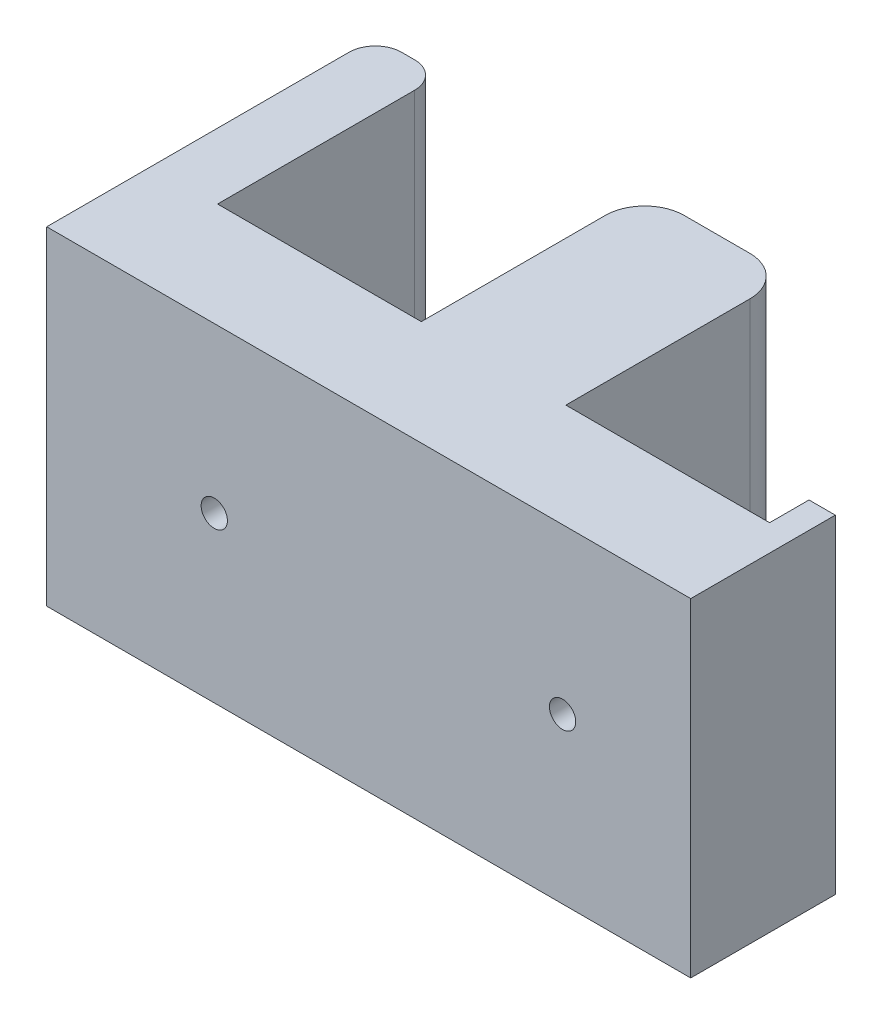
ISO-10303-21;
HEADER;
FILE_DESCRIPTION(('STEP AP214'),'2;1');
FILE_NAME('part.step','',(''),(''),'','','');
FILE_SCHEMA(('AUTOMOTIVE_DESIGN { 1 0 10303 214 1 1 1 1 }'));
ENDSEC;
DATA;
#1=APPLICATION_CONTEXT('core data for automotive mechanical design processes');
#2=APPLICATION_PROTOCOL_DEFINITION('international standard','automotive_design',2000,#1);
#3=PRODUCT_CONTEXT('',#1,'mechanical');
#4=PRODUCT('Part','Part','',(#3));
#5=PRODUCT_RELATED_PRODUCT_CATEGORY('part','',(#4));
#6=PRODUCT_DEFINITION_FORMATION('','',#4);
#7=PRODUCT_DEFINITION_CONTEXT('part definition',#1,'design');
#8=PRODUCT_DEFINITION('design','',#6,#7);
#9=PRODUCT_DEFINITION_SHAPE('','',#8);
#10=(LENGTH_UNIT() NAMED_UNIT(*) SI_UNIT(.MILLI.,.METRE.));
#11=(NAMED_UNIT(*) PLANE_ANGLE_UNIT() SI_UNIT($,.RADIAN.));
#12=(NAMED_UNIT(*) SI_UNIT($,.STERADIAN.) SOLID_ANGLE_UNIT());
#13=UNCERTAINTY_MEASURE_WITH_UNIT(LENGTH_MEASURE(1.E-05),#10,'distance_accuracy_value','');
#14=(GEOMETRIC_REPRESENTATION_CONTEXT(3) GLOBAL_UNCERTAINTY_ASSIGNED_CONTEXT((#13)) GLOBAL_UNIT_ASSIGNED_CONTEXT((#10,
#11,#12)) REPRESENTATION_CONTEXT('',''));
#15=CARTESIAN_POINT('',(0.,0.,0.));
#16=DIRECTION('',(0.,0.,1.));
#17=DIRECTION('',(1.,0.,0.));
#18=AXIS2_PLACEMENT_3D('',#15,#16,#17);
#19=CARTESIAN_POINT('',(0.,25.,0.));
#20=DIRECTION('',(0.,0.,-1.));
#21=DIRECTION('',(-1.,0.,0.));
#22=AXIS2_PLACEMENT_3D('',#19,#20,#21);
#23=PLANE('',#22);
#24=CARTESIAN_POINT('',(12.75,12.5,0.));
#25=DIRECTION('',(0.,0.,-1.));
#26=DIRECTION('',(-1.,0.,0.));
#27=AXIS2_PLACEMENT_3D('',#24,#25,#26);
#28=CIRCLE('',#27,1.);
#29=CARTESIAN_POINT('',(11.75,12.5,0.));
#30=VERTEX_POINT('',#29);
#31=EDGE_CURVE('E392',#30,#30,#28,.T.);
#32=ORIENTED_EDGE('',*,*,#31,.T.);
#33=EDGE_LOOP('',(#32));
#34=FACE_BOUND('',#33,.T.);
#35=CARTESIAN_POINT('',(39.25,12.5,0.));
#36=DIRECTION('',(0.,0.,-1.));
#37=DIRECTION('',(-1.,0.,0.));
#38=AXIS2_PLACEMENT_3D('',#35,#36,#37);
#39=CIRCLE('',#38,0.999999999999998);
#40=CARTESIAN_POINT('',(38.25,12.5,0.));
#41=VERTEX_POINT('',#40);
#42=EDGE_CURVE('E201',#41,#41,#39,.T.);
#43=ORIENTED_EDGE('',*,*,#42,.T.);
#44=EDGE_LOOP('',(#43));
#45=FACE_BOUND('',#44,.T.);
#46=DIRECTION('',(1.,0.,0.));
#47=VECTOR('',#46,1.);
#48=CARTESIAN_POINT('',(0.,0.,0.));
#49=LINE('',#48,#47);
#50=CARTESIAN_POINT('',(0.,0.,0.));
#51=VERTEX_POINT('',#50);
#52=CARTESIAN_POINT('',(49.,0.,0.));
#53=VERTEX_POINT('',#52);
#54=EDGE_CURVE('E163',#51,#53,#49,.T.);
#55=ORIENTED_EDGE('',*,*,#54,.T.);
#56=DIRECTION('',(0.,-1.,0.));
#57=VECTOR('',#56,1.);
#58=CARTESIAN_POINT('',(49.,25.,0.));
#59=LINE('',#58,#57);
#60=CARTESIAN_POINT('',(49.,25.,0.));
#61=VERTEX_POINT('',#60);
#62=EDGE_CURVE('E161',#61,#53,#59,.T.);
#63=ORIENTED_EDGE('',*,*,#62,.F.);
#64=DIRECTION('',(1.,0.,0.));
#65=VECTOR('',#64,1.);
#66=CARTESIAN_POINT('',(0.,25.,0.));
#67=LINE('',#66,#65);
#68=CARTESIAN_POINT('',(0.,25.,0.));
#69=VERTEX_POINT('',#68);
#70=EDGE_CURVE('E148',#69,#61,#67,.T.);
#71=ORIENTED_EDGE('',*,*,#70,.F.);
#72=DIRECTION('',(0.,-1.,0.));
#73=VECTOR('',#72,1.);
#74=CARTESIAN_POINT('',(0.,25.,0.));
#75=LINE('',#74,#73);
#76=EDGE_CURVE('E198',#69,#51,#75,.T.);
#77=ORIENTED_EDGE('',*,*,#76,.T.);
#78=EDGE_LOOP('',(#55,#63,#71,#77));
#79=FACE_BOUND('',#78,.T.);
#80=ADVANCED_FACE('F35',(#34,#45,#79),#23,.F.);
#81=CARTESIAN_POINT('',(49.,25.,0.));
#82=DIRECTION('',(1.,0.,0.));
#83=DIRECTION('',(0.,0.,-1.));
#84=AXIS2_PLACEMENT_3D('',#81,#82,#83);
#85=PLANE('',#84);
#86=DIRECTION('',(0.,0.,1.));
#87=VECTOR('',#86,1.);
#88=CARTESIAN_POINT('',(49.,0.,0.));
#89=LINE('',#88,#87);
#90=CARTESIAN_POINT('',(49.,0.,-11.));
#91=VERTEX_POINT('',#90);
#92=EDGE_CURVE('E200',#91,#53,#89,.T.);
#93=ORIENTED_EDGE('',*,*,#92,.F.);
#94=DIRECTION('',(0.,-1.,0.));
#95=VECTOR('',#94,1.);
#96=CARTESIAN_POINT('',(49.,25.,-11.));
#97=LINE('',#96,#95);
#98=CARTESIAN_POINT('',(49.,25.,-11.));
#99=VERTEX_POINT('',#98);
#100=EDGE_CURVE('E168',#99,#91,#97,.T.);
#101=ORIENTED_EDGE('',*,*,#100,.F.);
#102=DIRECTION('',(0.,0.,1.));
#103=VECTOR('',#102,1.);
#104=CARTESIAN_POINT('',(49.,25.,0.));
#105=LINE('',#104,#103);
#106=EDGE_CURVE('E153',#99,#61,#105,.T.);
#107=ORIENTED_EDGE('',*,*,#106,.T.);
#108=ORIENTED_EDGE('',*,*,#62,.T.);
#109=EDGE_LOOP('',(#93,#101,#107,#108));
#110=FACE_BOUND('',#109,.T.);
#111=ADVANCED_FACE('F170',(#110),#85,.T.);
#112=CARTESIAN_POINT('',(0.,25.,-11.0000000000001));
#113=DIRECTION('',(0.,0.,-1.));
#114=DIRECTION('',(-1.,0.,0.));
#115=AXIS2_PLACEMENT_3D('',#112,#113,#114);
#116=PLANE('',#115);
#117=DIRECTION('',(1.,0.,0.));
#118=VECTOR('',#117,1.);
#119=CARTESIAN_POINT('',(0.,0.,-11.0000000000001));
#120=LINE('',#119,#118);
#121=CARTESIAN_POINT('',(47.,0.,-11.));
#122=VERTEX_POINT('',#121);
#123=EDGE_CURVE('E203',#122,#91,#120,.T.);
#124=ORIENTED_EDGE('',*,*,#123,.F.);
#125=DIRECTION('',(0.,-1.,0.));
#126=VECTOR('',#125,1.);
#127=CARTESIAN_POINT('',(47.,25.,-11.));
#128=LINE('',#127,#126);
#129=CARTESIAN_POINT('',(47.,25.,-11.));
#130=VERTEX_POINT('',#129);
#131=EDGE_CURVE('E241',#130,#122,#128,.T.);
#132=ORIENTED_EDGE('',*,*,#131,.F.);
#133=DIRECTION('',(1.,0.,0.));
#134=VECTOR('',#133,1.);
#135=CARTESIAN_POINT('',(0.,25.,-11.0000000000001));
#136=LINE('',#135,#134);
#137=EDGE_CURVE('E171',#130,#99,#136,.T.);
#138=ORIENTED_EDGE('',*,*,#137,.T.);
#139=ORIENTED_EDGE('',*,*,#100,.T.);
#140=EDGE_LOOP('',(#124,#132,#138,#139));
#141=FACE_BOUND('',#140,.T.);
#142=ADVANCED_FACE('F327',(#141),#116,.T.);
#143=CARTESIAN_POINT('',(47.,25.,0.));
#144=DIRECTION('',(-1.,0.,0.));
#145=DIRECTION('',(0.,0.,1.));
#146=AXIS2_PLACEMENT_3D('',#143,#144,#145);
#147=PLANE('',#146);
#148=DIRECTION('',(0.,0.,-1.));
#149=VECTOR('',#148,1.);
#150=CARTESIAN_POINT('',(47.,0.,0.));
#151=LINE('',#150,#149);
#152=CARTESIAN_POINT('',(47.,0.,-8.));
#153=VERTEX_POINT('',#152);
#154=EDGE_CURVE('E206',#153,#122,#151,.T.);
#155=ORIENTED_EDGE('',*,*,#154,.F.);
#156=DIRECTION('',(0.,-1.,0.));
#157=VECTOR('',#156,1.);
#158=CARTESIAN_POINT('',(47.,25.,-8.));
#159=LINE('',#158,#157);
#160=CARTESIAN_POINT('',(47.,25.,-8.));
#161=VERTEX_POINT('',#160);
#162=EDGE_CURVE('E239',#161,#153,#159,.T.);
#163=ORIENTED_EDGE('',*,*,#162,.F.);
#164=DIRECTION('',(0.,0.,-1.));
#165=VECTOR('',#164,1.);
#166=CARTESIAN_POINT('',(47.,25.,0.));
#167=LINE('',#166,#165);
#168=EDGE_CURVE('E173',#161,#130,#167,.T.);
#169=ORIENTED_EDGE('',*,*,#168,.T.);
#170=ORIENTED_EDGE('',*,*,#131,.T.);
#171=EDGE_LOOP('',(#155,#163,#169,#170));
#172=FACE_BOUND('',#171,.T.);
#173=ADVANCED_FACE('F324',(#172),#147,.T.);
#174=CARTESIAN_POINT('',(0.,25.,-8.));
#175=DIRECTION('',(0.,0.,-1.));
#176=DIRECTION('',(-1.,0.,0.));
#177=AXIS2_PLACEMENT_3D('',#174,#175,#176);
#178=PLANE('',#177);
#179=CARTESIAN_POINT('',(39.25,12.5,-8.));
#180=DIRECTION('',(0.,0.,-1.));
#181=DIRECTION('',(-1.,0.,0.));
#182=AXIS2_PLACEMENT_3D('',#179,#180,#181);
#183=CIRCLE('',#182,0.999999999999998);
#184=CARTESIAN_POINT('',(38.25,12.5,-8.));
#185=VERTEX_POINT('',#184);
#186=EDGE_CURVE('E391',#185,#185,#183,.T.);
#187=ORIENTED_EDGE('',*,*,#186,.F.);
#188=EDGE_LOOP('',(#187));
#189=FACE_BOUND('',#188,.T.);
#190=DIRECTION('',(1.,0.,0.));
#191=VECTOR('',#190,1.);
#192=CARTESIAN_POINT('',(0.,0.,-8.));
#193=LINE('',#192,#191);
#194=CARTESIAN_POINT('',(31.5,0.,-8.));
#195=VERTEX_POINT('',#194);
#196=EDGE_CURVE('E209',#195,#153,#193,.T.);
#197=ORIENTED_EDGE('',*,*,#196,.F.);
#198=DIRECTION('',(0.,-1.,0.));
#199=VECTOR('',#198,1.);
#200=CARTESIAN_POINT('',(31.5,25.,-8.));
#201=LINE('',#200,#199);
#202=CARTESIAN_POINT('',(31.5,25.,-8.));
#203=VERTEX_POINT('',#202);
#204=EDGE_CURVE('E236',#203,#195,#201,.T.);
#205=ORIENTED_EDGE('',*,*,#204,.F.);
#206=DIRECTION('',(1.,0.,0.));
#207=VECTOR('',#206,1.);
#208=CARTESIAN_POINT('',(0.,25.,-8.));
#209=LINE('',#208,#207);
#210=EDGE_CURVE('E179',#203,#161,#209,.T.);
#211=ORIENTED_EDGE('',*,*,#210,.T.);
#212=ORIENTED_EDGE('',*,*,#162,.T.);
#213=EDGE_LOOP('',(#197,#205,#211,#212));
#214=FACE_BOUND('',#213,.T.);
#215=ADVANCED_FACE('F320',(#189,#214),#178,.T.);
#216=CARTESIAN_POINT('',(31.5,25.,0.));
#217=DIRECTION('',(1.,0.,0.));
#218=DIRECTION('',(0.,0.,-1.));
#219=AXIS2_PLACEMENT_3D('',#216,#217,#218);
#220=PLANE('',#219);
#221=DIRECTION('',(0.,0.,1.));
#222=VECTOR('',#221,1.);
#223=CARTESIAN_POINT('',(31.5,0.,0.));
#224=LINE('',#223,#222);
#225=CARTESIAN_POINT('',(31.5,0.,-22.));
#226=VERTEX_POINT('',#225);
#227=EDGE_CURVE('E212',#226,#195,#224,.T.);
#228=ORIENTED_EDGE('',*,*,#227,.F.);
#229=DIRECTION('',(0.,-1.,0.));
#230=VECTOR('',#229,1.);
#231=CARTESIAN_POINT('',(31.5,25.,-22.));
#232=LINE('',#231,#230);
#233=CARTESIAN_POINT('',(31.5,25.,-22.));
#234=VERTEX_POINT('',#233);
#235=EDGE_CURVE('E259',#226,#234,#232,.F.);
#236=ORIENTED_EDGE('',*,*,#235,.T.);
#237=DIRECTION('',(0.,0.,1.));
#238=VECTOR('',#237,1.);
#239=CARTESIAN_POINT('',(31.5,25.,0.));
#240=LINE('',#239,#238);
#241=EDGE_CURVE('E182',#234,#203,#240,.T.);
#242=ORIENTED_EDGE('',*,*,#241,.T.);
#243=ORIENTED_EDGE('',*,*,#204,.T.);
#244=EDGE_LOOP('',(#228,#236,#242,#243));
#245=FACE_BOUND('',#244,.T.);
#246=ADVANCED_FACE('F316',(#245),#220,.T.);
#247=CARTESIAN_POINT('',(0.,25.,-25.));
#248=DIRECTION('',(0.,0.,-1.));
#249=DIRECTION('',(-1.,0.,0.));
#250=AXIS2_PLACEMENT_3D('',#247,#248,#249);
#251=PLANE('',#250);
#252=DIRECTION('',(1.,0.,0.));
#253=VECTOR('',#252,1.);
#254=CARTESIAN_POINT('',(0.,0.,-25.));
#255=LINE('',#254,#253);
#256=CARTESIAN_POINT('',(23.5,0.,-25.));
#257=VERTEX_POINT('',#256);
#258=CARTESIAN_POINT('',(28.5,0.,-25.));
#259=VERTEX_POINT('',#258);
#260=EDGE_CURVE('E214',#257,#259,#255,.T.);
#261=ORIENTED_EDGE('',*,*,#260,.F.);
#262=DIRECTION('',(0.,-1.,0.));
#263=VECTOR('',#262,1.);
#264=CARTESIAN_POINT('',(23.5,25.,-25.));
#265=LINE('',#264,#263);
#266=CARTESIAN_POINT('',(23.5,25.,-25.));
#267=VERTEX_POINT('',#266);
#268=EDGE_CURVE('E253',#257,#267,#265,.F.);
#269=ORIENTED_EDGE('',*,*,#268,.T.);
#270=DIRECTION('',(1.,0.,0.));
#271=VECTOR('',#270,1.);
#272=CARTESIAN_POINT('',(0.,25.,-25.));
#273=LINE('',#272,#271);
#274=CARTESIAN_POINT('',(28.5,25.,-25.));
#275=VERTEX_POINT('',#274);
#276=EDGE_CURVE('E184',#267,#275,#273,.T.);
#277=ORIENTED_EDGE('',*,*,#276,.T.);
#278=DIRECTION('',(0.,-1.,0.));
#279=VECTOR('',#278,1.);
#280=CARTESIAN_POINT('',(28.5,25.,-25.));
#281=LINE('',#280,#279);
#282=EDGE_CURVE('E250',#275,#259,#281,.T.);
#283=ORIENTED_EDGE('',*,*,#282,.T.);
#284=EDGE_LOOP('',(#261,#269,#277,#283));
#285=FACE_BOUND('',#284,.T.);
#286=ADVANCED_FACE('F306',(#285),#251,.T.);
#287=CARTESIAN_POINT('',(20.5,25.,0.));
#288=DIRECTION('',(-1.,0.,0.));
#289=DIRECTION('',(0.,0.,1.));
#290=AXIS2_PLACEMENT_3D('',#287,#288,#289);
#291=PLANE('',#290);
#292=DIRECTION('',(0.,0.,-1.));
#293=VECTOR('',#292,1.);
#294=CARTESIAN_POINT('',(20.5,25.,0.));
#295=LINE('',#294,#293);
#296=CARTESIAN_POINT('',(20.5,25.,-8.));
#297=VERTEX_POINT('',#296);
#298=CARTESIAN_POINT('',(20.5,25.,-22.));
#299=VERTEX_POINT('',#298);
#300=EDGE_CURVE('E187',#297,#299,#295,.T.);
#301=ORIENTED_EDGE('',*,*,#300,.T.);
#302=DIRECTION('',(0.,-1.,0.));
#303=VECTOR('',#302,1.);
#304=CARTESIAN_POINT('',(20.5,25.,-22.));
#305=LINE('',#304,#303);
#306=CARTESIAN_POINT('',(20.5,0.,-22.));
#307=VERTEX_POINT('',#306);
#308=EDGE_CURVE('E167',#299,#307,#305,.T.);
#309=ORIENTED_EDGE('',*,*,#308,.T.);
#310=DIRECTION('',(0.,0.,-1.));
#311=VECTOR('',#310,1.);
#312=CARTESIAN_POINT('',(20.5,0.,0.));
#313=LINE('',#312,#311);
#314=CARTESIAN_POINT('',(20.5,0.,-8.));
#315=VERTEX_POINT('',#314);
#316=EDGE_CURVE('E217',#315,#307,#313,.T.);
#317=ORIENTED_EDGE('',*,*,#316,.F.);
#318=DIRECTION('',(0.,-1.,0.));
#319=VECTOR('',#318,1.);
#320=CARTESIAN_POINT('',(20.5,25.,-8.));
#321=LINE('',#320,#319);
#322=EDGE_CURVE('E234',#297,#315,#321,.T.);
#323=ORIENTED_EDGE('',*,*,#322,.F.);
#324=EDGE_LOOP('',(#301,#309,#317,#323));
#325=FACE_BOUND('',#324,.T.);
#326=ADVANCED_FACE('F297',(#325),#291,.T.);
#327=CARTESIAN_POINT('',(0.,25.,-8.));
#328=DIRECTION('',(0.,0.,-1.));
#329=DIRECTION('',(-1.,0.,0.));
#330=AXIS2_PLACEMENT_3D('',#327,#328,#329);
#331=PLANE('',#330);
#332=CARTESIAN_POINT('',(12.75,12.5,-8.));
#333=DIRECTION('',(0.,0.,-1.));
#334=DIRECTION('',(-1.,0.,0.));
#335=AXIS2_PLACEMENT_3D('',#332,#333,#334);
#336=CIRCLE('',#335,1.);
#337=CARTESIAN_POINT('',(11.75,12.5,-8.));
#338=VERTEX_POINT('',#337);
#339=EDGE_CURVE('E395',#338,#338,#336,.T.);
#340=ORIENTED_EDGE('',*,*,#339,.F.);
#341=EDGE_LOOP('',(#340));
#342=FACE_BOUND('',#341,.T.);
#343=DIRECTION('',(1.,0.,0.));
#344=VECTOR('',#343,1.);
#345=CARTESIAN_POINT('',(0.,0.,-8.));
#346=LINE('',#345,#344);
#347=CARTESIAN_POINT('',(5.,0.,-8.));
#348=VERTEX_POINT('',#347);
#349=EDGE_CURVE('E220',#348,#315,#346,.T.);
#350=ORIENTED_EDGE('',*,*,#349,.F.);
#351=DIRECTION('',(0.,-1.,0.));
#352=VECTOR('',#351,1.);
#353=CARTESIAN_POINT('',(5.,25.,-8.));
#354=LINE('',#353,#352);
#355=CARTESIAN_POINT('',(5.,25.,-8.));
#356=VERTEX_POINT('',#355);
#357=EDGE_CURVE('E231',#356,#348,#354,.T.);
#358=ORIENTED_EDGE('',*,*,#357,.F.);
#359=DIRECTION('',(1.,0.,0.));
#360=VECTOR('',#359,1.);
#361=CARTESIAN_POINT('',(0.,25.,-8.));
#362=LINE('',#361,#360);
#363=EDGE_CURVE('E190',#356,#297,#362,.T.);
#364=ORIENTED_EDGE('',*,*,#363,.T.);
#365=ORIENTED_EDGE('',*,*,#322,.T.);
#366=EDGE_LOOP('',(#350,#358,#364,#365));
#367=FACE_BOUND('',#366,.T.);
#368=ADVANCED_FACE('F293',(#342,#367),#331,.T.);
#369=CARTESIAN_POINT('',(5.,25.,0.));
#370=DIRECTION('',(1.,0.,0.));
#371=DIRECTION('',(0.,0.,-1.));
#372=AXIS2_PLACEMENT_3D('',#369,#370,#371);
#373=PLANE('',#372);
#374=DIRECTION('',(0.,0.,1.));
#375=VECTOR('',#374,1.);
#376=CARTESIAN_POINT('',(5.,0.,0.));
#377=LINE('',#376,#375);
#378=CARTESIAN_POINT('',(5.,0.,-23.));
#379=VERTEX_POINT('',#378);
#380=EDGE_CURVE('E223',#379,#348,#377,.T.);
#381=ORIENTED_EDGE('',*,*,#380,.F.);
#382=DIRECTION('',(0.,-1.,0.));
#383=VECTOR('',#382,1.);
#384=CARTESIAN_POINT('',(5.,25.,-23.));
#385=LINE('',#384,#383);
#386=CARTESIAN_POINT('',(5.,25.,-23.));
#387=VERTEX_POINT('',#386);
#388=EDGE_CURVE('E11',#379,#387,#385,.F.);
#389=ORIENTED_EDGE('',*,*,#388,.T.);
#390=DIRECTION('',(0.,0.,1.));
#391=VECTOR('',#390,1.);
#392=CARTESIAN_POINT('',(5.,25.,0.));
#393=LINE('',#392,#391);
#394=EDGE_CURVE('E193',#387,#356,#393,.T.);
#395=ORIENTED_EDGE('',*,*,#394,.T.);
#396=ORIENTED_EDGE('',*,*,#357,.T.);
#397=EDGE_LOOP('',(#381,#389,#395,#396));
#398=FACE_BOUND('',#397,.T.);
#399=ADVANCED_FACE('F288',(#398),#373,.T.);
#400=CARTESIAN_POINT('',(0.,25.,-25.));
#401=DIRECTION('',(0.,0.,-1.));
#402=DIRECTION('',(-1.,0.,0.));
#403=AXIS2_PLACEMENT_3D('',#400,#401,#402);
#404=PLANE('',#403);
#405=DIRECTION('',(1.,0.,0.));
#406=VECTOR('',#405,1.);
#407=CARTESIAN_POINT('',(0.,0.,-25.));
#408=LINE('',#407,#406);
#409=CARTESIAN_POINT('',(2.,0.,-25.));
#410=VERTEX_POINT('',#409);
#411=CARTESIAN_POINT('',(3.,0.,-25.));
#412=VERTEX_POINT('',#411);
#413=EDGE_CURVE('E225',#410,#412,#408,.T.);
#414=ORIENTED_EDGE('',*,*,#413,.F.);
#415=DIRECTION('',(0.,-1.,0.));
#416=VECTOR('',#415,1.);
#417=CARTESIAN_POINT('',(2.,25.,-25.));
#418=LINE('',#417,#416);
#419=CARTESIAN_POINT('',(2.,25.,-25.));
#420=VERTEX_POINT('',#419);
#421=EDGE_CURVE('E271',#410,#420,#418,.F.);
#422=ORIENTED_EDGE('',*,*,#421,.T.);
#423=DIRECTION('',(1.,0.,0.));
#424=VECTOR('',#423,1.);
#425=CARTESIAN_POINT('',(0.,25.,-25.));
#426=LINE('',#425,#424);
#427=CARTESIAN_POINT('',(3.,25.,-25.));
#428=VERTEX_POINT('',#427);
#429=EDGE_CURVE('E195',#420,#428,#426,.T.);
#430=ORIENTED_EDGE('',*,*,#429,.T.);
#431=DIRECTION('',(0.,-1.,0.));
#432=VECTOR('',#431,1.);
#433=CARTESIAN_POINT('',(3.,25.,-25.));
#434=LINE('',#433,#432);
#435=EDGE_CURVE('E268',#428,#412,#434,.T.);
#436=ORIENTED_EDGE('',*,*,#435,.T.);
#437=EDGE_LOOP('',(#414,#422,#430,#436));
#438=FACE_BOUND('',#437,.T.);
#439=ADVANCED_FACE('F285',(#438),#404,.T.);
#440=CARTESIAN_POINT('',(0.,25.,0.));
#441=DIRECTION('',(-1.,0.,0.));
#442=DIRECTION('',(0.,0.,1.));
#443=AXIS2_PLACEMENT_3D('',#440,#441,#442);
#444=PLANE('',#443);
#445=DIRECTION('',(0.,0.,-1.));
#446=VECTOR('',#445,1.);
#447=CARTESIAN_POINT('',(0.,25.,0.));
#448=LINE('',#447,#446);
#449=CARTESIAN_POINT('',(0.,25.,-23.));
#450=VERTEX_POINT('',#449);
#451=EDGE_CURVE('E156',#69,#450,#448,.T.);
#452=ORIENTED_EDGE('',*,*,#451,.T.);
#453=DIRECTION('',(0.,-1.,0.));
#454=VECTOR('',#453,1.);
#455=CARTESIAN_POINT('',(0.,25.,-23.));
#456=LINE('',#455,#454);
#457=CARTESIAN_POINT('',(0.,0.,-23.));
#458=VERTEX_POINT('',#457);
#459=EDGE_CURVE('E261',#450,#458,#456,.T.);
#460=ORIENTED_EDGE('',*,*,#459,.T.);
#461=DIRECTION('',(0.,0.,-1.));
#462=VECTOR('',#461,1.);
#463=CARTESIAN_POINT('',(0.,0.,0.));
#464=LINE('',#463,#462);
#465=EDGE_CURVE('E158',#51,#458,#464,.T.);
#466=ORIENTED_EDGE('',*,*,#465,.F.);
#467=ORIENTED_EDGE('',*,*,#76,.F.);
#468=EDGE_LOOP('',(#452,#460,#466,#467));
#469=FACE_BOUND('',#468,.T.);
#470=ADVANCED_FACE('F278',(#469),#444,.T.);
#471=CARTESIAN_POINT('',(0.,25.,0.));
#472=DIRECTION('',(0.,1.,0.));
#473=DIRECTION('',(0.,0.,1.));
#474=AXIS2_PLACEMENT_3D('',#471,#472,#473);
#475=PLANE('',#474);
#476=ORIENTED_EDGE('',*,*,#429,.F.);
#477=CARTESIAN_POINT('',(2.,25.,-23.));
#478=DIRECTION('',(0.,1.,0.));
#479=DIRECTION('',(0.,0.,1.));
#480=AXIS2_PLACEMENT_3D('',#477,#478,#479);
#481=CIRCLE('',#480,2.);
#482=EDGE_CURVE('E43',#420,#450,#481,.T.);
#483=ORIENTED_EDGE('',*,*,#482,.T.);
#484=ORIENTED_EDGE('',*,*,#451,.F.);
#485=ORIENTED_EDGE('',*,*,#70,.T.);
#486=ORIENTED_EDGE('',*,*,#106,.F.);
#487=ORIENTED_EDGE('',*,*,#137,.F.);
#488=ORIENTED_EDGE('',*,*,#168,.F.);
#489=ORIENTED_EDGE('',*,*,#210,.F.);
#490=ORIENTED_EDGE('',*,*,#241,.F.);
#491=CARTESIAN_POINT('',(28.5,25.,-22.));
#492=DIRECTION('',(0.,1.,0.));
#493=DIRECTION('',(0.,0.,1.));
#494=AXIS2_PLACEMENT_3D('',#491,#492,#493);
#495=CIRCLE('',#494,3.);
#496=EDGE_CURVE('E255',#234,#275,#495,.T.);
#497=ORIENTED_EDGE('',*,*,#496,.T.);
#498=ORIENTED_EDGE('',*,*,#276,.F.);
#499=CARTESIAN_POINT('',(23.5,25.,-22.));
#500=DIRECTION('',(0.,1.,0.));
#501=DIRECTION('',(0.,0.,1.));
#502=AXIS2_PLACEMENT_3D('',#499,#500,#501);
#503=CIRCLE('',#502,3.);
#504=EDGE_CURVE('E257',#267,#299,#503,.T.);
#505=ORIENTED_EDGE('',*,*,#504,.T.);
#506=ORIENTED_EDGE('',*,*,#300,.F.);
#507=ORIENTED_EDGE('',*,*,#363,.F.);
#508=ORIENTED_EDGE('',*,*,#394,.F.);
#509=CARTESIAN_POINT('',(3.,25.,-23.));
#510=DIRECTION('',(0.,1.,0.));
#511=DIRECTION('',(0.,0.,1.));
#512=AXIS2_PLACEMENT_3D('',#509,#510,#511);
#513=CIRCLE('',#512,2.);
#514=EDGE_CURVE('E55',#387,#428,#513,.T.);
#515=ORIENTED_EDGE('',*,*,#514,.T.);
#516=EDGE_LOOP('',(#476,#483,#484,#485,#486,#487,#488,#489,#490,#497,#498,#505,#506,#507,#508,#515));
#517=FACE_BOUND('',#516,.T.);
#518=ADVANCED_FACE('F150',(#517),#475,.T.);
#519=CARTESIAN_POINT('',(0.,0.,0.));
#520=DIRECTION('',(0.,1.,0.));
#521=DIRECTION('',(0.,0.,1.));
#522=AXIS2_PLACEMENT_3D('',#519,#520,#521);
#523=PLANE('',#522);
#524=ORIENTED_EDGE('',*,*,#465,.T.);
#525=CARTESIAN_POINT('',(2.,0.,-23.));
#526=DIRECTION('',(0.,1.,0.));
#527=DIRECTION('',(0.,0.,1.));
#528=AXIS2_PLACEMENT_3D('',#525,#526,#527);
#529=CIRCLE('',#528,2.);
#530=EDGE_CURVE('E266',#458,#410,#529,.F.);
#531=ORIENTED_EDGE('',*,*,#530,.T.);
#532=ORIENTED_EDGE('',*,*,#413,.T.);
#533=CARTESIAN_POINT('',(3.,0.,-23.));
#534=DIRECTION('',(0.,1.,0.));
#535=DIRECTION('',(0.,0.,1.));
#536=AXIS2_PLACEMENT_3D('',#533,#534,#535);
#537=CIRCLE('',#536,2.);
#538=EDGE_CURVE('E264',#412,#379,#537,.F.);
#539=ORIENTED_EDGE('',*,*,#538,.T.);
#540=ORIENTED_EDGE('',*,*,#380,.T.);
#541=ORIENTED_EDGE('',*,*,#349,.T.);
#542=ORIENTED_EDGE('',*,*,#316,.T.);
#543=CARTESIAN_POINT('',(23.5,0.,-22.));
#544=DIRECTION('',(0.,1.,0.));
#545=DIRECTION('',(0.,0.,1.));
#546=AXIS2_PLACEMENT_3D('',#543,#544,#545);
#547=CIRCLE('',#546,3.);
#548=EDGE_CURVE('E248',#307,#257,#547,.F.);
#549=ORIENTED_EDGE('',*,*,#548,.T.);
#550=ORIENTED_EDGE('',*,*,#260,.T.);
#551=CARTESIAN_POINT('',(28.5,0.,-22.));
#552=DIRECTION('',(0.,1.,0.));
#553=DIRECTION('',(0.,0.,1.));
#554=AXIS2_PLACEMENT_3D('',#551,#552,#553);
#555=CIRCLE('',#554,3.);
#556=EDGE_CURVE('E246',#259,#226,#555,.F.);
#557=ORIENTED_EDGE('',*,*,#556,.T.);
#558=ORIENTED_EDGE('',*,*,#227,.T.);
#559=ORIENTED_EDGE('',*,*,#196,.T.);
#560=ORIENTED_EDGE('',*,*,#154,.T.);
#561=ORIENTED_EDGE('',*,*,#123,.T.);
#562=ORIENTED_EDGE('',*,*,#92,.T.);
#563=ORIENTED_EDGE('',*,*,#54,.F.);
#564=EDGE_LOOP('',(#524,#531,#532,#539,#540,#541,#542,#549,#550,#557,#558,#559,#560,#561,#562,#563));
#565=FACE_BOUND('',#564,.T.);
#566=ADVANCED_FACE('F283',(#565),#523,.F.);
#567=CARTESIAN_POINT('',(23.5,25.,-22.));
#568=DIRECTION('',(0.,-1.,0.));
#569=DIRECTION('',(0.,0.,-1.));
#570=AXIS2_PLACEMENT_3D('',#567,#568,#569);
#571=CYLINDRICAL_SURFACE('',#570,3.);
#572=ORIENTED_EDGE('',*,*,#504,.F.);
#573=ORIENTED_EDGE('',*,*,#268,.F.);
#574=ORIENTED_EDGE('',*,*,#548,.F.);
#575=ORIENTED_EDGE('',*,*,#308,.F.);
#576=EDGE_LOOP('',(#572,#573,#574,#575));
#577=FACE_BOUND('',#576,.T.);
#578=ADVANCED_FACE('F302',(#577),#571,.T.);
#579=CARTESIAN_POINT('',(28.5,25.,-22.));
#580=DIRECTION('',(0.,-1.,0.));
#581=DIRECTION('',(0.,0.,-1.));
#582=AXIS2_PLACEMENT_3D('',#579,#580,#581);
#583=CYLINDRICAL_SURFACE('',#582,3.);
#584=ORIENTED_EDGE('',*,*,#496,.F.);
#585=ORIENTED_EDGE('',*,*,#235,.F.);
#586=ORIENTED_EDGE('',*,*,#556,.F.);
#587=ORIENTED_EDGE('',*,*,#282,.F.);
#588=EDGE_LOOP('',(#584,#585,#586,#587));
#589=FACE_BOUND('',#588,.T.);
#590=ADVANCED_FACE('F313',(#589),#583,.T.);
#591=CARTESIAN_POINT('',(2.,25.,-23.));
#592=DIRECTION('',(0.,-1.,0.));
#593=DIRECTION('',(0.,0.,-1.));
#594=AXIS2_PLACEMENT_3D('',#591,#592,#593);
#595=CYLINDRICAL_SURFACE('',#594,2.);
#596=ORIENTED_EDGE('',*,*,#482,.F.);
#597=ORIENTED_EDGE('',*,*,#421,.F.);
#598=ORIENTED_EDGE('',*,*,#530,.F.);
#599=ORIENTED_EDGE('',*,*,#459,.F.);
#600=EDGE_LOOP('',(#596,#597,#598,#599));
#601=FACE_BOUND('',#600,.T.);
#602=ADVANCED_FACE('F280',(#601),#595,.T.);
#603=CARTESIAN_POINT('',(3.,25.,-23.));
#604=DIRECTION('',(0.,-1.,0.));
#605=DIRECTION('',(0.,0.,-1.));
#606=AXIS2_PLACEMENT_3D('',#603,#604,#605);
#607=CYLINDRICAL_SURFACE('',#606,2.);
#608=ORIENTED_EDGE('',*,*,#514,.F.);
#609=ORIENTED_EDGE('',*,*,#388,.F.);
#610=ORIENTED_EDGE('',*,*,#538,.F.);
#611=ORIENTED_EDGE('',*,*,#435,.F.);
#612=EDGE_LOOP('',(#608,#609,#610,#611));
#613=FACE_BOUND('',#612,.T.);
#614=ADVANCED_FACE('F37',(#613),#607,.T.);
#615=CARTESIAN_POINT('',(39.25,12.5,0.));
#616=DIRECTION('',(0.,0.,-1.));
#617=DIRECTION('',(-1.,0.,0.));
#618=AXIS2_PLACEMENT_3D('',#615,#616,#617);
#619=CYLINDRICAL_SURFACE('',#618,0.999999999999998);
#620=ORIENTED_EDGE('',*,*,#42,.F.);
#621=EDGE_LOOP('',(#620));
#622=FACE_BOUND('',#621,.T.);
#623=ORIENTED_EDGE('',*,*,#186,.T.);
#624=EDGE_LOOP('',(#623));
#625=FACE_BOUND('',#624,.T.);
#626=ADVANCED_FACE('F351',(#622,#625),#619,.F.);
#627=CARTESIAN_POINT('',(12.75,12.5,0.));
#628=DIRECTION('',(0.,0.,-1.));
#629=DIRECTION('',(-1.,0.,0.));
#630=AXIS2_PLACEMENT_3D('',#627,#628,#629);
#631=CYLINDRICAL_SURFACE('',#630,1.);
#632=ORIENTED_EDGE('',*,*,#31,.F.);
#633=EDGE_LOOP('',(#632));
#634=FACE_BOUND('',#633,.T.);
#635=ORIENTED_EDGE('',*,*,#339,.T.);
#636=EDGE_LOOP('',(#635));
#637=FACE_BOUND('',#636,.T.);
#638=ADVANCED_FACE('F355',(#634,#637),#631,.F.);
#639=CLOSED_SHELL('',(#80,#111,#142,#173,#215,#246,#286,#326,#368,#399,#439,#470,#518,#566,#578,
#590,#602,#614,#626,#638));
#640=MANIFOLD_SOLID_BREP('B2',#639);
#641=ADVANCED_BREP_SHAPE_REPRESENTATION('',(#18,#640),#14);
#642=SHAPE_DEFINITION_REPRESENTATION(#9,#641);
ENDSEC;
END-ISO-10303-21;
